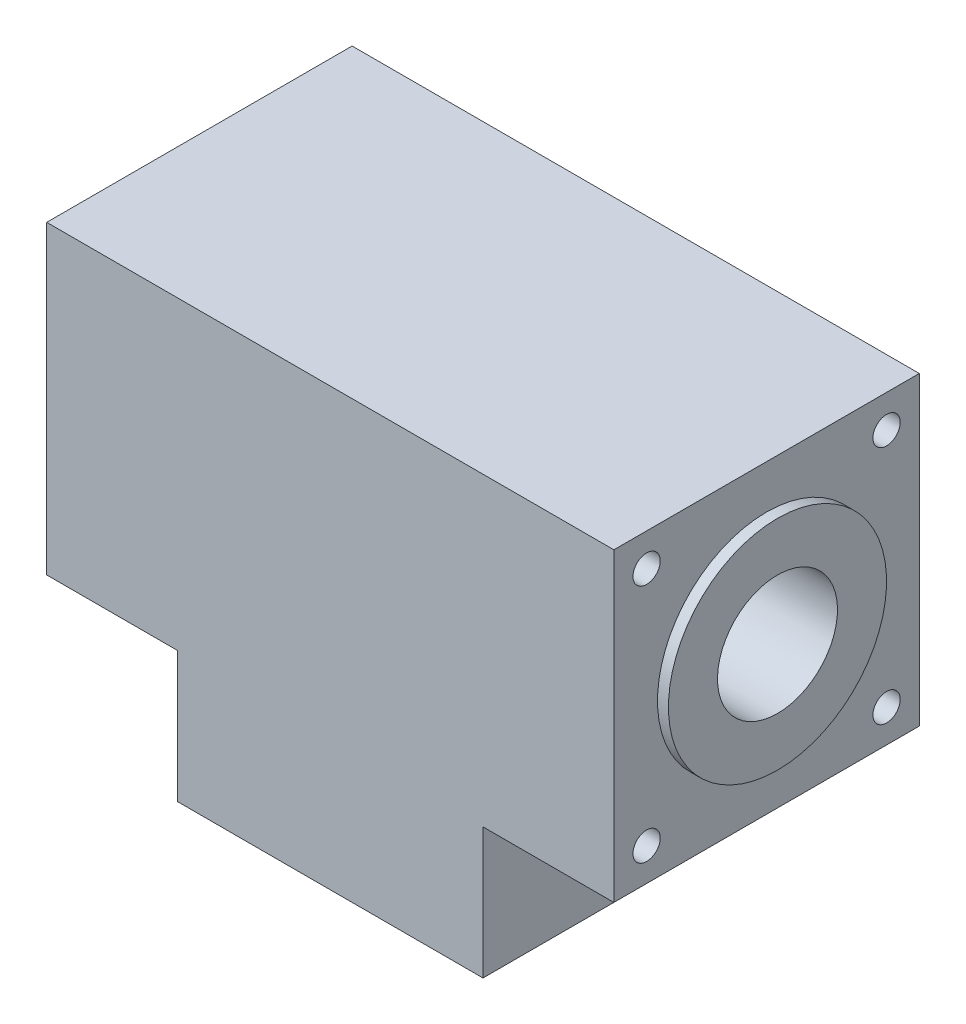
ISO-10303-21;
HEADER;
FILE_DESCRIPTION(('STEP AP214'),'2;1');
FILE_NAME('part.step','',(''),(''),'','','');
FILE_SCHEMA(('AUTOMOTIVE_DESIGN { 1 0 10303 214 1 1 1 1 }'));
ENDSEC;
DATA;
#1=APPLICATION_CONTEXT('core data for automotive mechanical design processes');
#2=APPLICATION_PROTOCOL_DEFINITION('international standard','automotive_design',2000,#1);
#3=PRODUCT_CONTEXT('',#1,'mechanical');
#4=PRODUCT('Part','Part','',(#3));
#5=PRODUCT_RELATED_PRODUCT_CATEGORY('part','',(#4));
#6=PRODUCT_DEFINITION_FORMATION('','',#4);
#7=PRODUCT_DEFINITION_CONTEXT('part definition',#1,'design');
#8=PRODUCT_DEFINITION('design','',#6,#7);
#9=PRODUCT_DEFINITION_SHAPE('','',#8);
#10=(LENGTH_UNIT() NAMED_UNIT(*) SI_UNIT(.MILLI.,.METRE.));
#11=(NAMED_UNIT(*) PLANE_ANGLE_UNIT() SI_UNIT($,.RADIAN.));
#12=(NAMED_UNIT(*) SI_UNIT($,.STERADIAN.) SOLID_ANGLE_UNIT());
#13=UNCERTAINTY_MEASURE_WITH_UNIT(LENGTH_MEASURE(1.E-05),#10,'distance_accuracy_value','');
#14=(GEOMETRIC_REPRESENTATION_CONTEXT(3) GLOBAL_UNCERTAINTY_ASSIGNED_CONTEXT((#13)) GLOBAL_UNIT_ASSIGNED_CONTEXT((#10,
#11,#12)) REPRESENTATION_CONTEXT('',''));
#15=CARTESIAN_POINT('',(0.,0.,0.));
#16=DIRECTION('',(0.,0.,1.));
#17=DIRECTION('',(1.,0.,0.));
#18=AXIS2_PLACEMENT_3D('',#15,#16,#17);
#19=CARTESIAN_POINT('',(54.,-28.,28.));
#20=DIRECTION('',(-1.,0.,0.));
#21=DIRECTION('',(0.,-1.,0.));
#22=AXIS2_PLACEMENT_3D('',#19,#20,#21);
#23=CYLINDRICAL_SURFACE('',#22,11.);
#24=CARTESIAN_POINT('',(54.,-28.,28.));
#25=DIRECTION('',(-1.,0.,0.));
#26=DIRECTION('',(0.,-1.,0.));
#27=AXIS2_PLACEMENT_3D('',#24,#25,#26);
#28=CIRCLE('',#27,11.);
#29=CARTESIAN_POINT('',(54.,-39.,28.));
#30=VERTEX_POINT('',#29);
#31=EDGE_CURVE('E207',#30,#30,#28,.T.);
#32=ORIENTED_EDGE('',*,*,#31,.F.);
#33=EDGE_LOOP('',(#32));
#34=FACE_BOUND('',#33,.T.);
#35=CARTESIAN_POINT('',(-54.,-28.,28.));
#36=DIRECTION('',(-1.,0.,0.));
#37=DIRECTION('',(0.,-1.,0.));
#38=AXIS2_PLACEMENT_3D('',#35,#36,#37);
#39=CIRCLE('',#38,11.);
#40=CARTESIAN_POINT('',(-54.,-39.,28.));
#41=VERTEX_POINT('',#40);
#42=EDGE_CURVE('E202',#41,#41,#39,.T.);
#43=ORIENTED_EDGE('',*,*,#42,.T.);
#44=EDGE_LOOP('',(#43));
#45=FACE_BOUND('',#44,.T.);
#46=DIRECTION('',(-1.,0.,0.));
#47=VECTOR('',#46,1.);
#48=CARTESIAN_POINT('',(54.,-31.,38.5830052442584));
#49=LINE('',#48,#47);
#50=CARTESIAN_POINT('',(-3.00000000000003,-31.,38.5830052442584));
#51=VERTEX_POINT('',#50);
#52=CARTESIAN_POINT('',(3.00000000000003,-31.,38.5830052442584));
#53=VERTEX_POINT('',#52);
#54=EDGE_CURVE('E11',#51,#53,#49,.F.);
#55=ORIENTED_EDGE('',*,*,#54,.F.);
#56=CARTESIAN_POINT('',(0.,-28.,28.));
#57=DIRECTION('',(-0.707106781186547,0.707106781186548,0.));
#58=DIRECTION('',(-0.707106781186548,-0.707106781186547,0.));
#59=AXIS2_PLACEMENT_3D('',#56,#57,#58);
#60=ELLIPSE('',#59,15.556349186104,11.);
#61=CARTESIAN_POINT('',(-3.00000000000002,-31.,17.4169947557416));
#62=VERTEX_POINT('',#61);
#63=EDGE_CURVE('E211',#51,#62,#60,.F.);
#64=ORIENTED_EDGE('',*,*,#63,.T.);
#65=DIRECTION('',(-1.,0.,0.));
#66=VECTOR('',#65,1.);
#67=CARTESIAN_POINT('',(54.,-31.,17.4169947557416));
#68=LINE('',#67,#66);
#69=CARTESIAN_POINT('',(3.00000000000002,-31.,17.4169947557416));
#70=VERTEX_POINT('',#69);
#71=EDGE_CURVE('E208',#70,#62,#68,.T.);
#72=ORIENTED_EDGE('',*,*,#71,.F.);
#73=CARTESIAN_POINT('',(0.,-28.,28.));
#74=DIRECTION('',(-0.707106781186548,-0.707106781186547,0.));
#75=DIRECTION('',(-0.707106781186547,0.707106781186548,0.));
#76=AXIS2_PLACEMENT_3D('',#73,#74,#75);
#77=ELLIPSE('',#76,15.556349186104,11.);
#78=EDGE_CURVE('E51',#70,#53,#77,.T.);
#79=ORIENTED_EDGE('',*,*,#78,.T.);
#80=EDGE_LOOP('',(#55,#64,#72,#79));
#81=FACE_BOUND('',#80,.T.);
#82=ADVANCED_FACE('F42',(#34,#45,#81),#23,.F.);
#83=CARTESIAN_POINT('',(-52.,0.,56.));
#84=DIRECTION('',(1.,0.,0.));
#85=DIRECTION('',(0.,0.,-1.));
#86=AXIS2_PLACEMENT_3D('',#83,#84,#85);
#87=PLANE('',#86);
#88=CARTESIAN_POINT('',(-52.,-5.99999999999998,6.00000000000001));
#89=DIRECTION('',(1.,0.,0.));
#90=DIRECTION('',(0.,1.,0.));
#91=AXIS2_PLACEMENT_3D('',#88,#89,#90);
#92=CIRCLE('',#91,2.5);
#93=CARTESIAN_POINT('',(-52.,-3.49999999999998,6.00000000000001));
#94=VERTEX_POINT('',#93);
#95=EDGE_CURVE('E269',#94,#94,#92,.T.);
#96=ORIENTED_EDGE('',*,*,#95,.T.);
#97=EDGE_LOOP('',(#96));
#98=FACE_BOUND('',#97,.T.);
#99=CARTESIAN_POINT('',(-52.,-50.,6.));
#100=DIRECTION('',(1.,0.,0.));
#101=DIRECTION('',(0.,1.,0.));
#102=AXIS2_PLACEMENT_3D('',#99,#100,#101);
#103=CIRCLE('',#102,2.5);
#104=CARTESIAN_POINT('',(-52.,-47.5,6.));
#105=VERTEX_POINT('',#104);
#106=EDGE_CURVE('E286',#105,#105,#103,.T.);
#107=ORIENTED_EDGE('',*,*,#106,.T.);
#108=EDGE_LOOP('',(#107));
#109=FACE_BOUND('',#108,.T.);
#110=CARTESIAN_POINT('',(-52.,-50.,50.));
#111=DIRECTION('',(1.,0.,0.));
#112=DIRECTION('',(0.,1.,0.));
#113=AXIS2_PLACEMENT_3D('',#110,#111,#112);
#114=CIRCLE('',#113,2.5);
#115=CARTESIAN_POINT('',(-52.,-47.5,50.));
#116=VERTEX_POINT('',#115);
#117=EDGE_CURVE('E278',#116,#116,#114,.T.);
#118=ORIENTED_EDGE('',*,*,#117,.T.);
#119=EDGE_LOOP('',(#118));
#120=FACE_BOUND('',#119,.T.);
#121=CARTESIAN_POINT('',(-52.,-5.99999999999998,50.));
#122=DIRECTION('',(1.,0.,0.));
#123=DIRECTION('',(0.,1.,0.));
#124=AXIS2_PLACEMENT_3D('',#121,#122,#123);
#125=CIRCLE('',#124,2.5);
#126=CARTESIAN_POINT('',(-52.,-3.49999999999998,50.));
#127=VERTEX_POINT('',#126);
#128=EDGE_CURVE('E277',#127,#127,#125,.T.);
#129=ORIENTED_EDGE('',*,*,#128,.T.);
#130=EDGE_LOOP('',(#129));
#131=FACE_BOUND('',#130,.T.);
#132=CARTESIAN_POINT('',(-52.,-28.,28.));
#133=DIRECTION('',(1.,0.,0.));
#134=DIRECTION('',(0.,1.,0.));
#135=AXIS2_PLACEMENT_3D('',#132,#133,#134);
#136=CIRCLE('',#135,20.);
#137=CARTESIAN_POINT('',(-52.,-7.99999999999997,28.));
#138=VERTEX_POINT('',#137);
#139=EDGE_CURVE('E340',#138,#138,#136,.T.);
#140=ORIENTED_EDGE('',*,*,#139,.T.);
#141=EDGE_LOOP('',(#140));
#142=FACE_BOUND('',#141,.T.);
#143=DIRECTION('',(0.,-1.,0.));
#144=VECTOR('',#143,1.);
#145=CARTESIAN_POINT('',(-52.,0.,0.));
#146=LINE('',#145,#144);
#147=CARTESIAN_POINT('',(-52.,0.,0.));
#148=VERTEX_POINT('',#147);
#149=CARTESIAN_POINT('',(-52.,-56.,0.));
#150=VERTEX_POINT('',#149);
#151=EDGE_CURVE('E155',#148,#150,#146,.T.);
#152=ORIENTED_EDGE('',*,*,#151,.T.);
#153=DIRECTION('',(0.,0.,-1.));
#154=VECTOR('',#153,1.);
#155=CARTESIAN_POINT('',(-52.,-56.,56.));
#156=LINE('',#155,#154);
#157=CARTESIAN_POINT('',(-52.,-56.,56.));
#158=VERTEX_POINT('',#157);
#159=EDGE_CURVE('E198',#158,#150,#156,.T.);
#160=ORIENTED_EDGE('',*,*,#159,.F.);
#161=DIRECTION('',(0.,-1.,0.));
#162=VECTOR('',#161,1.);
#163=CARTESIAN_POINT('',(-52.,0.,56.));
#164=LINE('',#163,#162);
#165=CARTESIAN_POINT('',(-52.,0.,56.));
#166=VERTEX_POINT('',#165);
#167=EDGE_CURVE('E179',#166,#158,#164,.T.);
#168=ORIENTED_EDGE('',*,*,#167,.F.);
#169=DIRECTION('',(0.,0.,-1.));
#170=VECTOR('',#169,1.);
#171=CARTESIAN_POINT('',(-52.,0.,56.));
#172=LINE('',#171,#170);
#173=EDGE_CURVE('E151',#166,#148,#172,.T.);
#174=ORIENTED_EDGE('',*,*,#173,.T.);
#175=EDGE_LOOP('',(#152,#160,#168,#174));
#176=FACE_BOUND('',#175,.T.);
#177=ADVANCED_FACE('F44',(#98,#109,#120,#131,#142,#176),#87,.F.);
#178=CARTESIAN_POINT('',(-52.,-56.,56.));
#179=DIRECTION('',(0.,1.,0.));
#180=DIRECTION('',(0.,0.,1.));
#181=AXIS2_PLACEMENT_3D('',#178,#179,#180);
#182=PLANE('',#181);
#183=DIRECTION('',(1.,0.,0.));
#184=VECTOR('',#183,1.);
#185=CARTESIAN_POINT('',(-52.,-56.,0.));
#186=LINE('',#185,#184);
#187=CARTESIAN_POINT('',(-28.,-56.,0.));
#188=VERTEX_POINT('',#187);
#189=EDGE_CURVE('E159',#150,#188,#186,.T.);
#190=ORIENTED_EDGE('',*,*,#189,.T.);
#191=DIRECTION('',(0.,0.,-1.));
#192=VECTOR('',#191,1.);
#193=CARTESIAN_POINT('',(-28.,-56.,56.));
#194=LINE('',#193,#192);
#195=CARTESIAN_POINT('',(-28.,-56.,56.));
#196=VERTEX_POINT('',#195);
#197=EDGE_CURVE('E194',#196,#188,#194,.T.);
#198=ORIENTED_EDGE('',*,*,#197,.F.);
#199=DIRECTION('',(1.,0.,0.));
#200=VECTOR('',#199,1.);
#201=CARTESIAN_POINT('',(-52.,-56.,56.));
#202=LINE('',#201,#200);
#203=EDGE_CURVE('E108',#158,#196,#202,.T.);
#204=ORIENTED_EDGE('',*,*,#203,.F.);
#205=ORIENTED_EDGE('',*,*,#159,.T.);
#206=EDGE_LOOP('',(#190,#198,#204,#205));
#207=FACE_BOUND('',#206,.T.);
#208=ADVANCED_FACE('F384',(#207),#182,.F.);
#209=CARTESIAN_POINT('',(-28.,-56.,56.));
#210=DIRECTION('',(1.,0.,0.));
#211=DIRECTION('',(0.,1.,0.));
#212=AXIS2_PLACEMENT_3D('',#209,#210,#211);
#213=PLANE('',#212);
#214=DIRECTION('',(0.,-1.,0.));
#215=VECTOR('',#214,1.);
#216=CARTESIAN_POINT('',(-28.,-56.,0.));
#217=LINE('',#216,#215);
#218=CARTESIAN_POINT('',(-28.,-80.,0.));
#219=VERTEX_POINT('',#218);
#220=EDGE_CURVE('E163',#188,#219,#217,.T.);
#221=ORIENTED_EDGE('',*,*,#220,.T.);
#222=DIRECTION('',(0.,0.,-1.));
#223=VECTOR('',#222,1.);
#224=CARTESIAN_POINT('',(-28.,-80.,56.));
#225=LINE('',#224,#223);
#226=CARTESIAN_POINT('',(-28.,-80.,56.));
#227=VERTEX_POINT('',#226);
#228=EDGE_CURVE('E190',#227,#219,#225,.T.);
#229=ORIENTED_EDGE('',*,*,#228,.F.);
#230=DIRECTION('',(0.,-1.,0.));
#231=VECTOR('',#230,1.);
#232=CARTESIAN_POINT('',(-28.,-56.,56.));
#233=LINE('',#232,#231);
#234=EDGE_CURVE('E361',#196,#227,#233,.T.);
#235=ORIENTED_EDGE('',*,*,#234,.F.);
#236=ORIENTED_EDGE('',*,*,#197,.T.);
#237=EDGE_LOOP('',(#221,#229,#235,#236));
#238=FACE_BOUND('',#237,.T.);
#239=ADVANCED_FACE('F387',(#238),#213,.F.);
#240=CARTESIAN_POINT('',(-28.,-80.,56.));
#241=DIRECTION('',(0.,1.,0.));
#242=DIRECTION('',(0.,0.,1.));
#243=AXIS2_PLACEMENT_3D('',#240,#241,#242);
#244=PLANE('',#243);
#245=CARTESIAN_POINT('',(-22.,-80.,6.));
#246=DIRECTION('',(0.,-1.,0.));
#247=DIRECTION('',(0.,0.,-1.));
#248=AXIS2_PLACEMENT_3D('',#245,#246,#247);
#249=CIRCLE('',#248,2.5);
#250=CARTESIAN_POINT('',(-22.,-80.,3.5));
#251=VERTEX_POINT('',#250);
#252=EDGE_CURVE('E258',#251,#251,#249,.T.);
#253=ORIENTED_EDGE('',*,*,#252,.F.);
#254=EDGE_LOOP('',(#253));
#255=FACE_BOUND('',#254,.T.);
#256=CARTESIAN_POINT('',(22.,-80.,6.));
#257=DIRECTION('',(0.,-1.,0.));
#258=DIRECTION('',(0.,0.,-1.));
#259=AXIS2_PLACEMENT_3D('',#256,#257,#258);
#260=CIRCLE('',#259,2.5);
#261=CARTESIAN_POINT('',(22.,-80.,3.5));
#262=VERTEX_POINT('',#261);
#263=EDGE_CURVE('E250',#262,#262,#260,.T.);
#264=ORIENTED_EDGE('',*,*,#263,.F.);
#265=EDGE_LOOP('',(#264));
#266=FACE_BOUND('',#265,.T.);
#267=CARTESIAN_POINT('',(22.,-80.,50.));
#268=DIRECTION('',(0.,-1.,0.));
#269=DIRECTION('',(0.,0.,-1.));
#270=AXIS2_PLACEMENT_3D('',#267,#268,#269);
#271=CIRCLE('',#270,2.5);
#272=CARTESIAN_POINT('',(22.,-80.,47.5));
#273=VERTEX_POINT('',#272);
#274=EDGE_CURVE('E241',#273,#273,#271,.T.);
#275=ORIENTED_EDGE('',*,*,#274,.F.);
#276=EDGE_LOOP('',(#275));
#277=FACE_BOUND('',#276,.T.);
#278=CARTESIAN_POINT('',(-22.,-80.,50.));
#279=DIRECTION('',(0.,-1.,0.));
#280=DIRECTION('',(0.,0.,-1.));
#281=AXIS2_PLACEMENT_3D('',#278,#279,#280);
#282=CIRCLE('',#281,2.5);
#283=CARTESIAN_POINT('',(-22.,-80.,47.5));
#284=VERTEX_POINT('',#283);
#285=EDGE_CURVE('E245',#284,#284,#282,.T.);
#286=ORIENTED_EDGE('',*,*,#285,.F.);
#287=EDGE_LOOP('',(#286));
#288=FACE_BOUND('',#287,.T.);
#289=CARTESIAN_POINT('',(0.,-80.,28.));
#290=DIRECTION('',(0.,-1.,0.));
#291=DIRECTION('',(0.,0.,-1.));
#292=AXIS2_PLACEMENT_3D('',#289,#290,#291);
#293=CIRCLE('',#292,20.);
#294=CARTESIAN_POINT('',(0.,-80.,8.));
#295=VERTEX_POINT('',#294);
#296=EDGE_CURVE('E212',#295,#295,#293,.T.);
#297=ORIENTED_EDGE('',*,*,#296,.F.);
#298=EDGE_LOOP('',(#297));
#299=FACE_BOUND('',#298,.T.);
#300=DIRECTION('',(1.,0.,0.));
#301=VECTOR('',#300,1.);
#302=CARTESIAN_POINT('',(-28.,-80.,0.));
#303=LINE('',#302,#301);
#304=CARTESIAN_POINT('',(28.,-80.,0.));
#305=VERTEX_POINT('',#304);
#306=EDGE_CURVE('E166',#219,#305,#303,.T.);
#307=ORIENTED_EDGE('',*,*,#306,.T.);
#308=DIRECTION('',(0.,0.,-1.));
#309=VECTOR('',#308,1.);
#310=CARTESIAN_POINT('',(28.,-80.,56.));
#311=LINE('',#310,#309);
#312=CARTESIAN_POINT('',(28.,-80.,56.));
#313=VERTEX_POINT('',#312);
#314=EDGE_CURVE('E186',#313,#305,#311,.T.);
#315=ORIENTED_EDGE('',*,*,#314,.F.);
#316=DIRECTION('',(1.,0.,0.));
#317=VECTOR('',#316,1.);
#318=CARTESIAN_POINT('',(-28.,-80.,56.));
#319=LINE('',#318,#317);
#320=EDGE_CURVE('E364',#227,#313,#319,.T.);
#321=ORIENTED_EDGE('',*,*,#320,.F.);
#322=ORIENTED_EDGE('',*,*,#228,.T.);
#323=EDGE_LOOP('',(#307,#315,#321,#322));
#324=FACE_BOUND('',#323,.T.);
#325=ADVANCED_FACE('F372',(#255,#266,#277,#288,#299,#324),#244,.F.);
#326=CARTESIAN_POINT('',(28.,-80.,56.));
#327=DIRECTION('',(-1.,0.,0.));
#328=DIRECTION('',(0.,-1.,0.));
#329=AXIS2_PLACEMENT_3D('',#326,#327,#328);
#330=PLANE('',#329);
#331=DIRECTION('',(0.,1.,0.));
#332=VECTOR('',#331,1.);
#333=CARTESIAN_POINT('',(28.,-80.,0.));
#334=LINE('',#333,#332);
#335=CARTESIAN_POINT('',(28.,-56.,0.));
#336=VERTEX_POINT('',#335);
#337=EDGE_CURVE('E169',#305,#336,#334,.T.);
#338=ORIENTED_EDGE('',*,*,#337,.T.);
#339=DIRECTION('',(0.,0.,-1.));
#340=VECTOR('',#339,1.);
#341=CARTESIAN_POINT('',(28.,-56.,56.));
#342=LINE('',#341,#340);
#343=CARTESIAN_POINT('',(28.,-56.,56.));
#344=VERTEX_POINT('',#343);
#345=EDGE_CURVE('E144',#344,#336,#342,.T.);
#346=ORIENTED_EDGE('',*,*,#345,.F.);
#347=DIRECTION('',(0.,1.,0.));
#348=VECTOR('',#347,1.);
#349=CARTESIAN_POINT('',(28.,-80.,56.));
#350=LINE('',#349,#348);
#351=EDGE_CURVE('E130',#313,#344,#350,.T.);
#352=ORIENTED_EDGE('',*,*,#351,.F.);
#353=ORIENTED_EDGE('',*,*,#314,.T.);
#354=EDGE_LOOP('',(#338,#346,#352,#353));
#355=FACE_BOUND('',#354,.T.);
#356=ADVANCED_FACE('F376',(#355),#330,.F.);
#357=CARTESIAN_POINT('',(28.,-56.,56.));
#358=DIRECTION('',(0.,1.,0.));
#359=DIRECTION('',(-1.,0.,0.));
#360=AXIS2_PLACEMENT_3D('',#357,#358,#359);
#361=PLANE('',#360);
#362=DIRECTION('',(1.,0.,0.));
#363=VECTOR('',#362,1.);
#364=CARTESIAN_POINT('',(28.,-56.,0.));
#365=LINE('',#364,#363);
#366=CARTESIAN_POINT('',(52.,-56.,0.));
#367=VERTEX_POINT('',#366);
#368=EDGE_CURVE('E140',#336,#367,#365,.T.);
#369=ORIENTED_EDGE('',*,*,#368,.T.);
#370=DIRECTION('',(0.,0.,-1.));
#371=VECTOR('',#370,1.);
#372=CARTESIAN_POINT('',(52.,-56.,56.));
#373=LINE('',#372,#371);
#374=CARTESIAN_POINT('',(52.,-56.,56.));
#375=VERTEX_POINT('',#374);
#376=EDGE_CURVE('E137',#375,#367,#373,.T.);
#377=ORIENTED_EDGE('',*,*,#376,.F.);
#378=DIRECTION('',(1.,0.,0.));
#379=VECTOR('',#378,1.);
#380=CARTESIAN_POINT('',(28.,-56.,56.));
#381=LINE('',#380,#379);
#382=EDGE_CURVE('E123',#344,#375,#381,.T.);
#383=ORIENTED_EDGE('',*,*,#382,.F.);
#384=ORIENTED_EDGE('',*,*,#345,.T.);
#385=EDGE_LOOP('',(#369,#377,#383,#384));
#386=FACE_BOUND('',#385,.T.);
#387=ADVANCED_FACE('F138',(#386),#361,.F.);
#388=CARTESIAN_POINT('',(52.,-56.,56.));
#389=DIRECTION('',(-1.,0.,0.));
#390=DIRECTION('',(0.,-1.,0.));
#391=AXIS2_PLACEMENT_3D('',#388,#389,#390);
#392=PLANE('',#391);
#393=CARTESIAN_POINT('',(52.,-5.99999999999998,6.00000000000001));
#394=DIRECTION('',(1.,0.,0.));
#395=DIRECTION('',(0.,1.,0.));
#396=AXIS2_PLACEMENT_3D('',#393,#394,#395);
#397=CIRCLE('',#396,2.5);
#398=CARTESIAN_POINT('',(52.,-3.49999999999998,6.00000000000001));
#399=VERTEX_POINT('',#398);
#400=EDGE_CURVE('E322',#399,#399,#397,.T.);
#401=ORIENTED_EDGE('',*,*,#400,.F.);
#402=EDGE_LOOP('',(#401));
#403=FACE_BOUND('',#402,.T.);
#404=CARTESIAN_POINT('',(52.,-50.,6.));
#405=DIRECTION('',(1.,0.,0.));
#406=DIRECTION('',(0.,1.,0.));
#407=AXIS2_PLACEMENT_3D('',#404,#405,#406);
#408=CIRCLE('',#407,2.5);
#409=CARTESIAN_POINT('',(52.,-47.5,6.));
#410=VERTEX_POINT('',#409);
#411=EDGE_CURVE('E314',#410,#410,#408,.T.);
#412=ORIENTED_EDGE('',*,*,#411,.F.);
#413=EDGE_LOOP('',(#412));
#414=FACE_BOUND('',#413,.T.);
#415=CARTESIAN_POINT('',(52.,-50.,50.));
#416=DIRECTION('',(1.,0.,0.));
#417=DIRECTION('',(0.,1.,0.));
#418=AXIS2_PLACEMENT_3D('',#415,#416,#417);
#419=CIRCLE('',#418,2.5);
#420=CARTESIAN_POINT('',(52.,-47.5,50.));
#421=VERTEX_POINT('',#420);
#422=EDGE_CURVE('E305',#421,#421,#419,.T.);
#423=ORIENTED_EDGE('',*,*,#422,.F.);
#424=EDGE_LOOP('',(#423));
#425=FACE_BOUND('',#424,.T.);
#426=CARTESIAN_POINT('',(52.,-5.99999999999998,50.));
#427=DIRECTION('',(1.,0.,0.));
#428=DIRECTION('',(0.,1.,0.));
#429=AXIS2_PLACEMENT_3D('',#426,#427,#428);
#430=CIRCLE('',#429,2.5);
#431=CARTESIAN_POINT('',(52.,-3.49999999999998,50.));
#432=VERTEX_POINT('',#431);
#433=EDGE_CURVE('E309',#432,#432,#430,.T.);
#434=ORIENTED_EDGE('',*,*,#433,.F.);
#435=EDGE_LOOP('',(#434));
#436=FACE_BOUND('',#435,.T.);
#437=CARTESIAN_POINT('',(52.,-28.,28.));
#438=DIRECTION('',(1.,0.,0.));
#439=DIRECTION('',(0.,1.,0.));
#440=AXIS2_PLACEMENT_3D('',#437,#438,#439);
#441=CIRCLE('',#440,20.);
#442=CARTESIAN_POINT('',(52.,-7.99999999999997,28.));
#443=VERTEX_POINT('',#442);
#444=EDGE_CURVE('E201',#443,#443,#441,.T.);
#445=ORIENTED_EDGE('',*,*,#444,.F.);
#446=EDGE_LOOP('',(#445));
#447=FACE_BOUND('',#446,.T.);
#448=DIRECTION('',(0.,1.,0.));
#449=VECTOR('',#448,1.);
#450=CARTESIAN_POINT('',(52.,-56.,0.));
#451=LINE('',#450,#449);
#452=CARTESIAN_POINT('',(52.,0.,0.));
#453=VERTEX_POINT('',#452);
#454=EDGE_CURVE('E174',#367,#453,#451,.T.);
#455=ORIENTED_EDGE('',*,*,#454,.T.);
#456=DIRECTION('',(0.,0.,-1.));
#457=VECTOR('',#456,1.);
#458=CARTESIAN_POINT('',(52.,0.,56.));
#459=LINE('',#458,#457);
#460=CARTESIAN_POINT('',(52.,0.,56.));
#461=VERTEX_POINT('',#460);
#462=EDGE_CURVE('E145',#461,#453,#459,.T.);
#463=ORIENTED_EDGE('',*,*,#462,.F.);
#464=DIRECTION('',(0.,1.,0.));
#465=VECTOR('',#464,1.);
#466=CARTESIAN_POINT('',(52.,-56.,56.));
#467=LINE('',#466,#465);
#468=EDGE_CURVE('E127',#375,#461,#467,.T.);
#469=ORIENTED_EDGE('',*,*,#468,.F.);
#470=ORIENTED_EDGE('',*,*,#376,.T.);
#471=EDGE_LOOP('',(#455,#463,#469,#470));
#472=FACE_BOUND('',#471,.T.);
#473=ADVANCED_FACE('F147',(#403,#414,#425,#436,#447,#472),#392,.F.);
#474=CARTESIAN_POINT('',(-52.,0.,56.));
#475=DIRECTION('',(0.,-1.,0.));
#476=DIRECTION('',(1.,0.,0.));
#477=AXIS2_PLACEMENT_3D('',#474,#475,#476);
#478=PLANE('',#477);
#479=DIRECTION('',(-1.,0.,0.));
#480=VECTOR('',#479,1.);
#481=CARTESIAN_POINT('',(-52.,0.,0.));
#482=LINE('',#481,#480);
#483=EDGE_CURVE('E99',#453,#148,#482,.T.);
#484=ORIENTED_EDGE('',*,*,#483,.T.);
#485=ORIENTED_EDGE('',*,*,#173,.F.);
#486=DIRECTION('',(-1.,0.,0.));
#487=VECTOR('',#486,1.);
#488=CARTESIAN_POINT('',(-52.,0.,56.));
#489=LINE('',#488,#487);
#490=EDGE_CURVE('E66',#461,#166,#489,.T.);
#491=ORIENTED_EDGE('',*,*,#490,.F.);
#492=ORIENTED_EDGE('',*,*,#462,.T.);
#493=EDGE_LOOP('',(#484,#485,#491,#492));
#494=FACE_BOUND('',#493,.T.);
#495=ADVANCED_FACE('F380',(#494),#478,.F.);
#496=CARTESIAN_POINT('',(0.,0.,56.));
#497=DIRECTION('',(0.,0.,1.));
#498=DIRECTION('',(1.,0.,0.));
#499=AXIS2_PLACEMENT_3D('',#496,#497,#498);
#500=PLANE('',#499);
#501=ORIENTED_EDGE('',*,*,#167,.T.);
#502=ORIENTED_EDGE('',*,*,#203,.T.);
#503=ORIENTED_EDGE('',*,*,#234,.T.);
#504=ORIENTED_EDGE('',*,*,#320,.T.);
#505=ORIENTED_EDGE('',*,*,#351,.T.);
#506=ORIENTED_EDGE('',*,*,#382,.T.);
#507=ORIENTED_EDGE('',*,*,#468,.T.);
#508=ORIENTED_EDGE('',*,*,#490,.T.);
#509=EDGE_LOOP('',(#501,#502,#503,#504,#505,#506,#507,#508));
#510=FACE_BOUND('',#509,.T.);
#511=ADVANCED_FACE('F125',(#510),#500,.T.);
#512=CARTESIAN_POINT('',(0.,0.,0.));
#513=DIRECTION('',(0.,0.,1.));
#514=DIRECTION('',(1.,0.,0.));
#515=AXIS2_PLACEMENT_3D('',#512,#513,#514);
#516=PLANE('',#515);
#517=ORIENTED_EDGE('',*,*,#151,.F.);
#518=ORIENTED_EDGE('',*,*,#483,.F.);
#519=ORIENTED_EDGE('',*,*,#454,.F.);
#520=ORIENTED_EDGE('',*,*,#368,.F.);
#521=ORIENTED_EDGE('',*,*,#337,.F.);
#522=ORIENTED_EDGE('',*,*,#306,.F.);
#523=ORIENTED_EDGE('',*,*,#220,.F.);
#524=ORIENTED_EDGE('',*,*,#189,.F.);
#525=EDGE_LOOP('',(#517,#518,#519,#520,#521,#522,#523,#524));
#526=FACE_BOUND('',#525,.T.);
#527=ADVANCED_FACE('F379',(#526),#516,.F.);
#528=CARTESIAN_POINT('',(54.,-28.,28.));
#529=DIRECTION('',(-1.,0.,0.));
#530=DIRECTION('',(0.,-1.,0.));
#531=AXIS2_PLACEMENT_3D('',#528,#529,#530);
#532=CYLINDRICAL_SURFACE('',#531,20.);
#533=CARTESIAN_POINT('',(54.,-28.,28.));
#534=DIRECTION('',(1.,0.,0.));
#535=DIRECTION('',(0.,1.,0.));
#536=AXIS2_PLACEMENT_3D('',#533,#534,#535);
#537=CIRCLE('',#536,20.);
#538=CARTESIAN_POINT('',(54.,-7.99999999999997,28.));
#539=VERTEX_POINT('',#538);
#540=EDGE_CURVE('E160',#539,#539,#537,.T.);
#541=ORIENTED_EDGE('',*,*,#540,.F.);
#542=EDGE_LOOP('',(#541));
#543=FACE_BOUND('',#542,.T.);
#544=ORIENTED_EDGE('',*,*,#444,.T.);
#545=EDGE_LOOP('',(#544));
#546=FACE_BOUND('',#545,.T.);
#547=ADVANCED_FACE('F523',(#543,#546),#532,.T.);
#548=CARTESIAN_POINT('',(54.,-28.,28.));
#549=DIRECTION('',(1.,0.,0.));
#550=DIRECTION('',(0.,1.,0.));
#551=AXIS2_PLACEMENT_3D('',#548,#549,#550);
#552=PLANE('',#551);
#553=ORIENTED_EDGE('',*,*,#31,.T.);
#554=EDGE_LOOP('',(#553));
#555=FACE_BOUND('',#554,.T.);
#556=ORIENTED_EDGE('',*,*,#540,.T.);
#557=EDGE_LOOP('',(#556));
#558=FACE_BOUND('',#557,.T.);
#559=ADVANCED_FACE('F519',(#555,#558),#552,.T.);
#560=CARTESIAN_POINT('',(-54.,-28.,28.));
#561=DIRECTION('',(1.,0.,0.));
#562=DIRECTION('',(0.,1.,0.));
#563=AXIS2_PLACEMENT_3D('',#560,#561,#562);
#564=CYLINDRICAL_SURFACE('',#563,20.);
#565=CARTESIAN_POINT('',(-54.,-28.,28.));
#566=DIRECTION('',(1.,0.,0.));
#567=DIRECTION('',(0.,1.,0.));
#568=AXIS2_PLACEMENT_3D('',#565,#566,#567);
#569=CIRCLE('',#568,20.);
#570=CARTESIAN_POINT('',(-54.,-7.99999999999997,28.));
#571=VERTEX_POINT('',#570);
#572=EDGE_CURVE('E344',#571,#571,#569,.T.);
#573=ORIENTED_EDGE('',*,*,#572,.T.);
#574=EDGE_LOOP('',(#573));
#575=FACE_BOUND('',#574,.T.);
#576=ORIENTED_EDGE('',*,*,#139,.F.);
#577=EDGE_LOOP('',(#576));
#578=FACE_BOUND('',#577,.T.);
#579=ADVANCED_FACE('F515',(#575,#578),#564,.T.);
#580=CARTESIAN_POINT('',(-54.,-28.,28.));
#581=DIRECTION('',(-1.,0.,0.));
#582=DIRECTION('',(0.,1.,0.));
#583=AXIS2_PLACEMENT_3D('',#580,#581,#582);
#584=PLANE('',#583);
#585=ORIENTED_EDGE('',*,*,#42,.F.);
#586=EDGE_LOOP('',(#585));
#587=FACE_BOUND('',#586,.T.);
#588=ORIENTED_EDGE('',*,*,#572,.F.);
#589=EDGE_LOOP('',(#588));
#590=FACE_BOUND('',#589,.T.);
#591=ADVANCED_FACE('F511',(#587,#590),#584,.T.);
#592=CARTESIAN_POINT('',(0.,-82.,28.));
#593=DIRECTION('',(0.,1.,0.));
#594=DIRECTION('',(0.,0.,1.));
#595=AXIS2_PLACEMENT_3D('',#592,#593,#594);
#596=CYLINDRICAL_SURFACE('',#595,20.);
#597=CARTESIAN_POINT('',(0.,-82.,28.));
#598=DIRECTION('',(0.,-1.,0.));
#599=DIRECTION('',(0.,0.,-1.));
#600=AXIS2_PLACEMENT_3D('',#597,#598,#599);
#601=CIRCLE('',#600,20.);
#602=CARTESIAN_POINT('',(0.,-82.,8.));
#603=VERTEX_POINT('',#602);
#604=EDGE_CURVE('E333',#603,#603,#601,.T.);
#605=ORIENTED_EDGE('',*,*,#604,.F.);
#606=EDGE_LOOP('',(#605));
#607=FACE_BOUND('',#606,.T.);
#608=ORIENTED_EDGE('',*,*,#296,.T.);
#609=EDGE_LOOP('',(#608));
#610=FACE_BOUND('',#609,.T.);
#611=ADVANCED_FACE('F507',(#607,#610),#596,.T.);
#612=CARTESIAN_POINT('',(0.,-82.,28.));
#613=DIRECTION('',(0.,-1.,0.));
#614=DIRECTION('',(0.,0.,-1.));
#615=AXIS2_PLACEMENT_3D('',#612,#613,#614);
#616=PLANE('',#615);
#617=CARTESIAN_POINT('',(0.,-82.,28.));
#618=DIRECTION('',(0.,-1.,0.));
#619=DIRECTION('',(0.,0.,-1.));
#620=AXIS2_PLACEMENT_3D('',#617,#618,#619);
#621=CIRCLE('',#620,11.);
#622=CARTESIAN_POINT('',(0.,-82.,17.));
#623=VERTEX_POINT('',#622);
#624=EDGE_CURVE('E236',#623,#623,#621,.T.);
#625=ORIENTED_EDGE('',*,*,#624,.F.);
#626=EDGE_LOOP('',(#625));
#627=FACE_BOUND('',#626,.T.);
#628=ORIENTED_EDGE('',*,*,#604,.T.);
#629=EDGE_LOOP('',(#628));
#630=FACE_BOUND('',#629,.T.);
#631=ADVANCED_FACE('F503',(#627,#630),#616,.T.);
#632=CARTESIAN_POINT('',(41.,-5.99999999999998,50.));
#633=DIRECTION('',(1.,0.,0.));
#634=DIRECTION('',(0.,1.,0.));
#635=AXIS2_PLACEMENT_3D('',#632,#633,#634);
#636=CYLINDRICAL_SURFACE('',#635,2.5);
#637=CARTESIAN_POINT('',(41.,-5.99999999999998,50.));
#638=DIRECTION('',(1.,0.,0.));
#639=DIRECTION('',(0.,1.,0.));
#640=AXIS2_PLACEMENT_3D('',#637,#638,#639);
#641=CIRCLE('',#640,2.5);
#642=CARTESIAN_POINT('',(41.,-3.49999999999998,50.));
#643=VERTEX_POINT('',#642);
#644=EDGE_CURVE('E329',#643,#643,#641,.T.);
#645=ORIENTED_EDGE('',*,*,#644,.F.);
#646=EDGE_LOOP('',(#645));
#647=FACE_BOUND('',#646,.T.);
#648=ORIENTED_EDGE('',*,*,#433,.T.);
#649=EDGE_LOOP('',(#648));
#650=FACE_BOUND('',#649,.T.);
#651=ADVANCED_FACE('F499',(#647,#650),#636,.F.);
#652=CARTESIAN_POINT('',(41.,-5.99999999999998,50.));
#653=DIRECTION('',(1.,0.,0.));
#654=DIRECTION('',(0.,1.,0.));
#655=AXIS2_PLACEMENT_3D('',#652,#653,#654);
#656=PLANE('',#655);
#657=ORIENTED_EDGE('',*,*,#644,.T.);
#658=EDGE_LOOP('',(#657));
#659=FACE_BOUND('',#658,.T.);
#660=ADVANCED_FACE('F477',(#659),#656,.T.);
#661=CARTESIAN_POINT('',(41.,-50.,50.));
#662=DIRECTION('',(1.,0.,0.));
#663=DIRECTION('',(0.,1.,0.));
#664=AXIS2_PLACEMENT_3D('',#661,#662,#663);
#665=CYLINDRICAL_SURFACE('',#664,2.5);
#666=CARTESIAN_POINT('',(41.,-50.,50.));
#667=DIRECTION('',(1.,0.,0.));
#668=DIRECTION('',(0.,1.,0.));
#669=AXIS2_PLACEMENT_3D('',#666,#667,#668);
#670=CIRCLE('',#669,2.5);
#671=CARTESIAN_POINT('',(41.,-47.5,50.));
#672=VERTEX_POINT('',#671);
#673=EDGE_CURVE('E310',#672,#672,#670,.T.);
#674=ORIENTED_EDGE('',*,*,#673,.F.);
#675=EDGE_LOOP('',(#674));
#676=FACE_BOUND('',#675,.T.);
#677=ORIENTED_EDGE('',*,*,#422,.T.);
#678=EDGE_LOOP('',(#677));
#679=FACE_BOUND('',#678,.T.);
#680=ADVANCED_FACE('F473',(#676,#679),#665,.F.);
#681=CARTESIAN_POINT('',(41.,-50.,50.));
#682=DIRECTION('',(1.,0.,0.));
#683=DIRECTION('',(0.,1.,0.));
#684=AXIS2_PLACEMENT_3D('',#681,#682,#683);
#685=PLANE('',#684);
#686=ORIENTED_EDGE('',*,*,#673,.T.);
#687=EDGE_LOOP('',(#686));
#688=FACE_BOUND('',#687,.T.);
#689=ADVANCED_FACE('F476',(#688),#685,.T.);
#690=CARTESIAN_POINT('',(41.,-50.,6.));
#691=DIRECTION('',(1.,0.,0.));
#692=DIRECTION('',(0.,1.,0.));
#693=AXIS2_PLACEMENT_3D('',#690,#691,#692);
#694=CYLINDRICAL_SURFACE('',#693,2.5);
#695=CARTESIAN_POINT('',(41.,-50.,6.));
#696=DIRECTION('',(1.,0.,0.));
#697=DIRECTION('',(0.,1.,0.));
#698=AXIS2_PLACEMENT_3D('',#695,#696,#697);
#699=CIRCLE('',#698,2.5);
#700=CARTESIAN_POINT('',(41.,-47.5,6.));
#701=VERTEX_POINT('',#700);
#702=EDGE_CURVE('E318',#701,#701,#699,.T.);
#703=ORIENTED_EDGE('',*,*,#702,.F.);
#704=EDGE_LOOP('',(#703));
#705=FACE_BOUND('',#704,.T.);
#706=ORIENTED_EDGE('',*,*,#411,.T.);
#707=EDGE_LOOP('',(#706));
#708=FACE_BOUND('',#707,.T.);
#709=ADVANCED_FACE('F481',(#705,#708),#694,.F.);
#710=CARTESIAN_POINT('',(41.,-50.,6.));
#711=DIRECTION('',(1.,0.,0.));
#712=DIRECTION('',(0.,1.,0.));
#713=AXIS2_PLACEMENT_3D('',#710,#711,#712);
#714=PLANE('',#713);
#715=ORIENTED_EDGE('',*,*,#702,.T.);
#716=EDGE_LOOP('',(#715));
#717=FACE_BOUND('',#716,.T.);
#718=ADVANCED_FACE('F485',(#717),#714,.T.);
#719=CARTESIAN_POINT('',(41.,-5.99999999999998,6.00000000000001));
#720=DIRECTION('',(1.,0.,0.));
#721=DIRECTION('',(0.,1.,0.));
#722=AXIS2_PLACEMENT_3D('',#719,#720,#721);
#723=CYLINDRICAL_SURFACE('',#722,2.5);
#724=CARTESIAN_POINT('',(41.,-5.99999999999998,6.00000000000001));
#725=DIRECTION('',(1.,0.,0.));
#726=DIRECTION('',(0.,1.,0.));
#727=AXIS2_PLACEMENT_3D('',#724,#725,#726);
#728=CIRCLE('',#727,2.5);
#729=CARTESIAN_POINT('',(41.,-3.49999999999998,6.00000000000001));
#730=VERTEX_POINT('',#729);
#731=EDGE_CURVE('E301',#730,#730,#728,.T.);
#732=ORIENTED_EDGE('',*,*,#731,.F.);
#733=EDGE_LOOP('',(#732));
#734=FACE_BOUND('',#733,.T.);
#735=ORIENTED_EDGE('',*,*,#400,.T.);
#736=EDGE_LOOP('',(#735));
#737=FACE_BOUND('',#736,.T.);
#738=ADVANCED_FACE('F489',(#734,#737),#723,.F.);
#739=CARTESIAN_POINT('',(41.,-5.99999999999998,6.00000000000001));
#740=DIRECTION('',(1.,0.,0.));
#741=DIRECTION('',(0.,1.,0.));
#742=AXIS2_PLACEMENT_3D('',#739,#740,#741);
#743=PLANE('',#742);
#744=ORIENTED_EDGE('',*,*,#731,.T.);
#745=EDGE_LOOP('',(#744));
#746=FACE_BOUND('',#745,.T.);
#747=ADVANCED_FACE('F471',(#746),#743,.T.);
#748=CARTESIAN_POINT('',(-41.,-5.99999999999998,50.));
#749=DIRECTION('',(-1.,0.,0.));
#750=DIRECTION('',(0.,-1.,0.));
#751=AXIS2_PLACEMENT_3D('',#748,#749,#750);
#752=CYLINDRICAL_SURFACE('',#751,2.5);
#753=CARTESIAN_POINT('',(-41.,-5.99999999999998,50.));
#754=DIRECTION('',(1.,0.,0.));
#755=DIRECTION('',(0.,1.,0.));
#756=AXIS2_PLACEMENT_3D('',#753,#754,#755);
#757=CIRCLE('',#756,2.5);
#758=CARTESIAN_POINT('',(-41.,-3.49999999999998,50.));
#759=VERTEX_POINT('',#758);
#760=EDGE_CURVE('E297',#759,#759,#757,.T.);
#761=ORIENTED_EDGE('',*,*,#760,.T.);
#762=EDGE_LOOP('',(#761));
#763=FACE_BOUND('',#762,.T.);
#764=ORIENTED_EDGE('',*,*,#128,.F.);
#765=EDGE_LOOP('',(#764));
#766=FACE_BOUND('',#765,.T.);
#767=ADVANCED_FACE('F467',(#763,#766),#752,.F.);
#768=CARTESIAN_POINT('',(-41.,-5.99999999999998,50.));
#769=DIRECTION('',(-1.,0.,0.));
#770=DIRECTION('',(0.,1.,0.));
#771=AXIS2_PLACEMENT_3D('',#768,#769,#770);
#772=PLANE('',#771);
#773=ORIENTED_EDGE('',*,*,#760,.F.);
#774=EDGE_LOOP('',(#773));
#775=FACE_BOUND('',#774,.T.);
#776=ADVANCED_FACE('F449',(#775),#772,.T.);
#777=CARTESIAN_POINT('',(-41.,-50.,50.));
#778=DIRECTION('',(-1.,0.,0.));
#779=DIRECTION('',(0.,-1.,0.));
#780=AXIS2_PLACEMENT_3D('',#777,#778,#779);
#781=CYLINDRICAL_SURFACE('',#780,2.5);
#782=CARTESIAN_POINT('',(-41.,-50.,50.));
#783=DIRECTION('',(1.,0.,0.));
#784=DIRECTION('',(0.,1.,0.));
#785=AXIS2_PLACEMENT_3D('',#782,#783,#784);
#786=CIRCLE('',#785,2.5);
#787=CARTESIAN_POINT('',(-41.,-47.5,50.));
#788=VERTEX_POINT('',#787);
#789=EDGE_CURVE('E273',#788,#788,#786,.T.);
#790=ORIENTED_EDGE('',*,*,#789,.T.);
#791=EDGE_LOOP('',(#790));
#792=FACE_BOUND('',#791,.T.);
#793=ORIENTED_EDGE('',*,*,#117,.F.);
#794=EDGE_LOOP('',(#793));
#795=FACE_BOUND('',#794,.T.);
#796=ADVANCED_FACE('F445',(#792,#795),#781,.F.);
#797=CARTESIAN_POINT('',(-41.,-50.,50.));
#798=DIRECTION('',(-1.,0.,0.));
#799=DIRECTION('',(0.,1.,0.));
#800=AXIS2_PLACEMENT_3D('',#797,#798,#799);
#801=PLANE('',#800);
#802=ORIENTED_EDGE('',*,*,#789,.F.);
#803=EDGE_LOOP('',(#802));
#804=FACE_BOUND('',#803,.T.);
#805=ADVANCED_FACE('F441',(#804),#801,.T.);
#806=CARTESIAN_POINT('',(-41.,-50.,6.));
#807=DIRECTION('',(-1.,0.,0.));
#808=DIRECTION('',(0.,-1.,0.));
#809=AXIS2_PLACEMENT_3D('',#806,#807,#808);
#810=CYLINDRICAL_SURFACE('',#809,2.5);
#811=CARTESIAN_POINT('',(-41.,-50.,6.));
#812=DIRECTION('',(1.,0.,0.));
#813=DIRECTION('',(0.,1.,0.));
#814=AXIS2_PLACEMENT_3D('',#811,#812,#813);
#815=CIRCLE('',#814,2.5);
#816=CARTESIAN_POINT('',(-41.,-47.5,6.));
#817=VERTEX_POINT('',#816);
#818=EDGE_CURVE('E282',#817,#817,#815,.T.);
#819=ORIENTED_EDGE('',*,*,#818,.T.);
#820=EDGE_LOOP('',(#819));
#821=FACE_BOUND('',#820,.T.);
#822=ORIENTED_EDGE('',*,*,#106,.F.);
#823=EDGE_LOOP('',(#822));
#824=FACE_BOUND('',#823,.T.);
#825=ADVANCED_FACE('F444',(#821,#824),#810,.F.);
#826=CARTESIAN_POINT('',(-41.,-50.,6.));
#827=DIRECTION('',(-1.,0.,0.));
#828=DIRECTION('',(0.,1.,0.));
#829=AXIS2_PLACEMENT_3D('',#826,#827,#828);
#830=PLANE('',#829);
#831=ORIENTED_EDGE('',*,*,#818,.F.);
#832=EDGE_LOOP('',(#831));
#833=FACE_BOUND('',#832,.T.);
#834=ADVANCED_FACE('F451',(#833),#830,.T.);
#835=CARTESIAN_POINT('',(-41.,-5.99999999999998,6.00000000000001));
#836=DIRECTION('',(-1.,0.,0.));
#837=DIRECTION('',(0.,-1.,0.));
#838=AXIS2_PLACEMENT_3D('',#835,#836,#837);
#839=CYLINDRICAL_SURFACE('',#838,2.5);
#840=CARTESIAN_POINT('',(-41.,-5.99999999999998,6.00000000000001));
#841=DIRECTION('',(1.,0.,0.));
#842=DIRECTION('',(0.,1.,0.));
#843=AXIS2_PLACEMENT_3D('',#840,#841,#842);
#844=CIRCLE('',#843,2.5);
#845=CARTESIAN_POINT('',(-41.,-3.49999999999998,6.00000000000001));
#846=VERTEX_POINT('',#845);
#847=EDGE_CURVE('E290',#846,#846,#844,.T.);
#848=ORIENTED_EDGE('',*,*,#847,.T.);
#849=EDGE_LOOP('',(#848));
#850=FACE_BOUND('',#849,.T.);
#851=ORIENTED_EDGE('',*,*,#95,.F.);
#852=EDGE_LOOP('',(#851));
#853=FACE_BOUND('',#852,.T.);
#854=ADVANCED_FACE('F454',(#850,#853),#839,.F.);
#855=CARTESIAN_POINT('',(-41.,-5.99999999999998,6.00000000000001));
#856=DIRECTION('',(-1.,0.,0.));
#857=DIRECTION('',(0.,1.,0.));
#858=AXIS2_PLACEMENT_3D('',#855,#856,#857);
#859=PLANE('',#858);
#860=ORIENTED_EDGE('',*,*,#847,.F.);
#861=EDGE_LOOP('',(#860));
#862=FACE_BOUND('',#861,.T.);
#863=ADVANCED_FACE('F439',(#862),#859,.T.);
#864=CARTESIAN_POINT('',(-22.,-69.,50.));
#865=DIRECTION('',(0.,-1.,0.));
#866=DIRECTION('',(0.,0.,-1.));
#867=AXIS2_PLACEMENT_3D('',#864,#865,#866);
#868=CYLINDRICAL_SURFACE('',#867,2.5);
#869=CARTESIAN_POINT('',(-22.,-69.,50.));
#870=DIRECTION('',(0.,-1.,0.));
#871=DIRECTION('',(0.,0.,-1.));
#872=AXIS2_PLACEMENT_3D('',#869,#870,#871);
#873=CIRCLE('',#872,2.5);
#874=CARTESIAN_POINT('',(-22.,-69.,47.5));
#875=VERTEX_POINT('',#874);
#876=EDGE_CURVE('E265',#875,#875,#873,.T.);
#877=ORIENTED_EDGE('',*,*,#876,.F.);
#878=EDGE_LOOP('',(#877));
#879=FACE_BOUND('',#878,.T.);
#880=ORIENTED_EDGE('',*,*,#285,.T.);
#881=EDGE_LOOP('',(#880));
#882=FACE_BOUND('',#881,.T.);
#883=ADVANCED_FACE('F435',(#879,#882),#868,.F.);
#884=CARTESIAN_POINT('',(-22.,-69.,50.));
#885=DIRECTION('',(0.,-1.,0.));
#886=DIRECTION('',(0.,0.,-1.));
#887=AXIS2_PLACEMENT_3D('',#884,#885,#886);
#888=PLANE('',#887);
#889=ORIENTED_EDGE('',*,*,#876,.T.);
#890=EDGE_LOOP('',(#889));
#891=FACE_BOUND('',#890,.T.);
#892=ADVANCED_FACE('F412',(#891),#888,.T.);
#893=CARTESIAN_POINT('',(22.,-69.,50.));
#894=DIRECTION('',(0.,-1.,0.));
#895=DIRECTION('',(0.,0.,-1.));
#896=AXIS2_PLACEMENT_3D('',#893,#894,#895);
#897=CYLINDRICAL_SURFACE('',#896,2.5);
#898=CARTESIAN_POINT('',(22.,-69.,50.));
#899=DIRECTION('',(0.,-1.,0.));
#900=DIRECTION('',(0.,0.,-1.));
#901=AXIS2_PLACEMENT_3D('',#898,#899,#900);
#902=CIRCLE('',#901,2.5);
#903=CARTESIAN_POINT('',(22.,-69.,47.5));
#904=VERTEX_POINT('',#903);
#905=EDGE_CURVE('E246',#904,#904,#902,.T.);
#906=ORIENTED_EDGE('',*,*,#905,.F.);
#907=EDGE_LOOP('',(#906));
#908=FACE_BOUND('',#907,.T.);
#909=ORIENTED_EDGE('',*,*,#274,.T.);
#910=EDGE_LOOP('',(#909));
#911=FACE_BOUND('',#910,.T.);
#912=ADVANCED_FACE('F408',(#908,#911),#897,.F.);
#913=CARTESIAN_POINT('',(22.,-69.,50.));
#914=DIRECTION('',(0.,-1.,0.));
#915=DIRECTION('',(0.,0.,-1.));
#916=AXIS2_PLACEMENT_3D('',#913,#914,#915);
#917=PLANE('',#916);
#918=ORIENTED_EDGE('',*,*,#905,.T.);
#919=EDGE_LOOP('',(#918));
#920=FACE_BOUND('',#919,.T.);
#921=ADVANCED_FACE('F411',(#920),#917,.T.);
#922=CARTESIAN_POINT('',(22.,-69.,6.));
#923=DIRECTION('',(0.,-1.,0.));
#924=DIRECTION('',(0.,0.,-1.));
#925=AXIS2_PLACEMENT_3D('',#922,#923,#924);
#926=CYLINDRICAL_SURFACE('',#925,2.5);
#927=CARTESIAN_POINT('',(22.,-69.,6.));
#928=DIRECTION('',(0.,-1.,0.));
#929=DIRECTION('',(0.,0.,-1.));
#930=AXIS2_PLACEMENT_3D('',#927,#928,#929);
#931=CIRCLE('',#930,2.5);
#932=CARTESIAN_POINT('',(22.,-69.,3.5));
#933=VERTEX_POINT('',#932);
#934=EDGE_CURVE('E254',#933,#933,#931,.T.);
#935=ORIENTED_EDGE('',*,*,#934,.F.);
#936=EDGE_LOOP('',(#935));
#937=FACE_BOUND('',#936,.T.);
#938=ORIENTED_EDGE('',*,*,#263,.T.);
#939=EDGE_LOOP('',(#938));
#940=FACE_BOUND('',#939,.T.);
#941=ADVANCED_FACE('F416',(#937,#940),#926,.F.);
#942=CARTESIAN_POINT('',(22.,-69.,6.));
#943=DIRECTION('',(0.,-1.,0.));
#944=DIRECTION('',(0.,0.,-1.));
#945=AXIS2_PLACEMENT_3D('',#942,#943,#944);
#946=PLANE('',#945);
#947=ORIENTED_EDGE('',*,*,#934,.T.);
#948=EDGE_LOOP('',(#947));
#949=FACE_BOUND('',#948,.T.);
#950=ADVANCED_FACE('F420',(#949),#946,.T.);
#951=CARTESIAN_POINT('',(-22.,-69.,6.));
#952=DIRECTION('',(0.,-1.,0.));
#953=DIRECTION('',(0.,0.,-1.));
#954=AXIS2_PLACEMENT_3D('',#951,#952,#953);
#955=CYLINDRICAL_SURFACE('',#954,2.5);
#956=CARTESIAN_POINT('',(-22.,-69.,6.));
#957=DIRECTION('',(0.,-1.,0.));
#958=DIRECTION('',(0.,0.,-1.));
#959=AXIS2_PLACEMENT_3D('',#956,#957,#958);
#960=CIRCLE('',#959,2.5);
#961=CARTESIAN_POINT('',(-22.,-69.,3.5));
#962=VERTEX_POINT('',#961);
#963=EDGE_CURVE('E206',#962,#962,#960,.T.);
#964=ORIENTED_EDGE('',*,*,#963,.F.);
#965=EDGE_LOOP('',(#964));
#966=FACE_BOUND('',#965,.T.);
#967=ORIENTED_EDGE('',*,*,#252,.T.);
#968=EDGE_LOOP('',(#967));
#969=FACE_BOUND('',#968,.T.);
#970=ADVANCED_FACE('F424',(#966,#969),#955,.F.);
#971=CARTESIAN_POINT('',(-22.,-69.,6.));
#972=DIRECTION('',(0.,-1.,0.));
#973=DIRECTION('',(0.,0.,-1.));
#974=AXIS2_PLACEMENT_3D('',#971,#972,#973);
#975=PLANE('',#974);
#976=ORIENTED_EDGE('',*,*,#963,.T.);
#977=EDGE_LOOP('',(#976));
#978=FACE_BOUND('',#977,.T.);
#979=ADVANCED_FACE('F428',(#978),#975,.T.);
#980=CARTESIAN_POINT('',(0.,-31.,28.));
#981=DIRECTION('',(0.,-1.,0.));
#982=DIRECTION('',(0.,0.,-1.));
#983=AXIS2_PLACEMENT_3D('',#980,#981,#982);
#984=CYLINDRICAL_SURFACE('',#983,11.);
#985=ORIENTED_EDGE('',*,*,#624,.T.);
#986=EDGE_LOOP('',(#985));
#987=FACE_BOUND('',#986,.T.);
#988=CARTESIAN_POINT('',(0.,-31.,28.));
#989=DIRECTION('',(0.,-1.,0.));
#990=DIRECTION('',(0.,0.,-1.));
#991=AXIS2_PLACEMENT_3D('',#988,#989,#990);
#992=CIRCLE('',#991,11.);
#993=EDGE_CURVE('E57',#62,#70,#992,.T.);
#994=ORIENTED_EDGE('',*,*,#993,.F.);
#995=ORIENTED_EDGE('',*,*,#63,.F.);
#996=EDGE_CURVE('E228',#53,#51,#992,.T.);
#997=ORIENTED_EDGE('',*,*,#996,.F.);
#998=ORIENTED_EDGE('',*,*,#78,.F.);
#999=EDGE_LOOP('',(#994,#995,#997,#998));
#1000=FACE_BOUND('',#999,.T.);
#1001=ADVANCED_FACE('F225',(#987,#1000),#984,.F.);
#1002=CARTESIAN_POINT('',(0.,-31.,28.));
#1003=DIRECTION('',(0.,-1.,0.));
#1004=DIRECTION('',(0.,0.,-1.));
#1005=AXIS2_PLACEMENT_3D('',#1002,#1003,#1004);
#1006=PLANE('',#1005);
#1007=ORIENTED_EDGE('',*,*,#54,.T.);
#1008=ORIENTED_EDGE('',*,*,#996,.T.);
#1009=EDGE_LOOP('',(#1007,#1008));
#1010=FACE_BOUND('',#1009,.T.);
#1011=ADVANCED_FACE('F691',(#1010),#1006,.T.);
#1012=ORIENTED_EDGE('',*,*,#71,.T.);
#1013=ORIENTED_EDGE('',*,*,#993,.T.);
#1014=EDGE_LOOP('',(#1012,#1013));
#1015=FACE_BOUND('',#1014,.T.);
#1016=ADVANCED_FACE('F698',(#1015),#1006,.T.);
#1017=CLOSED_SHELL('',(#82,#177,#208,#239,#325,#356,#387,#473,#495,#511,#527,#547,#559,#579,
#591,#611,#631,#651,#660,#680,#689,#709,#718,#738,#747,#767,#776,#796,#805,#825,#834,#854,#863,
#883,#892,#912,#921,#941,#950,#970,#979,#1001,#1011,#1016));
#1018=MANIFOLD_SOLID_BREP('B2',#1017);
#1019=ADVANCED_BREP_SHAPE_REPRESENTATION('',(#18,#1018),#14);
#1020=SHAPE_DEFINITION_REPRESENTATION(#9,#1019);
ENDSEC;
END-ISO-10303-21;
